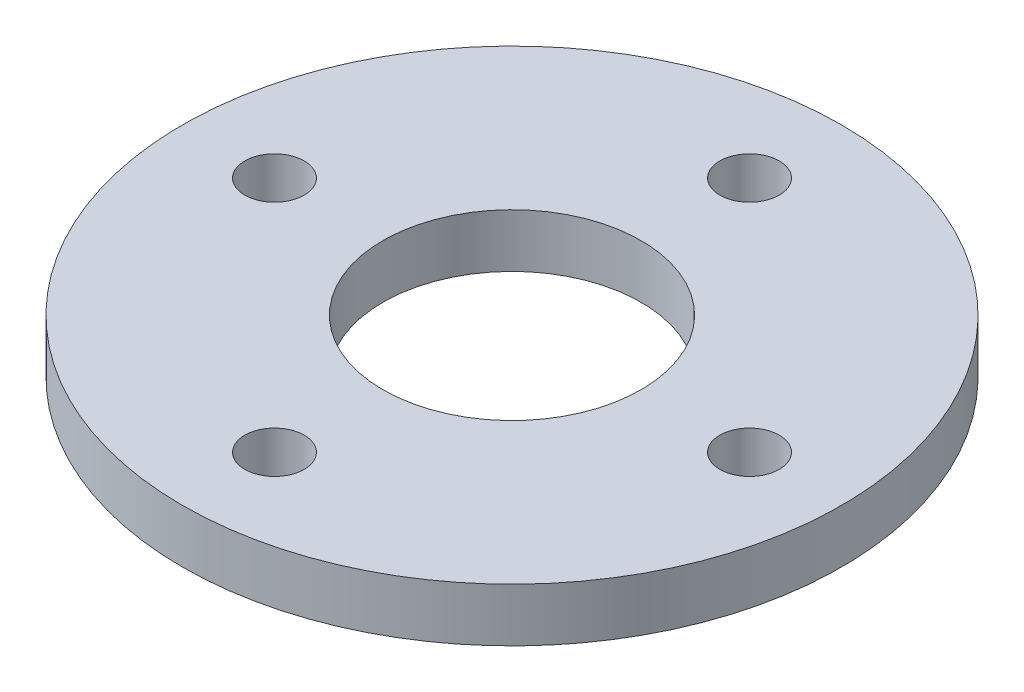
ISO-10303-21;
HEADER;
FILE_DESCRIPTION(('STEP AP214'),'2;1');
FILE_NAME('part.step','',(''),(''),'','','');
FILE_SCHEMA(('AUTOMOTIVE_DESIGN { 1 0 10303 214 1 1 1 1 }'));
ENDSEC;
DATA;
#1=APPLICATION_CONTEXT('core data for automotive mechanical design processes');
#2=APPLICATION_PROTOCOL_DEFINITION('international standard','automotive_design',2000,#1);
#3=PRODUCT_CONTEXT('',#1,'mechanical');
#4=PRODUCT('Part','Part','',(#3));
#5=PRODUCT_RELATED_PRODUCT_CATEGORY('part','',(#4));
#6=PRODUCT_DEFINITION_FORMATION('','',#4);
#7=PRODUCT_DEFINITION_CONTEXT('part definition',#1,'design');
#8=PRODUCT_DEFINITION('design','',#6,#7);
#9=PRODUCT_DEFINITION_SHAPE('','',#8);
#10=(LENGTH_UNIT() NAMED_UNIT(*) SI_UNIT(.MILLI.,.METRE.));
#11=(NAMED_UNIT(*) PLANE_ANGLE_UNIT() SI_UNIT($,.RADIAN.));
#12=(NAMED_UNIT(*) SI_UNIT($,.STERADIAN.) SOLID_ANGLE_UNIT());
#13=UNCERTAINTY_MEASURE_WITH_UNIT(LENGTH_MEASURE(1.E-05),#10,'distance_accuracy_value','');
#14=(GEOMETRIC_REPRESENTATION_CONTEXT(3) GLOBAL_UNCERTAINTY_ASSIGNED_CONTEXT((#13)) GLOBAL_UNIT_ASSIGNED_CONTEXT((#10,
#11,#12)) REPRESENTATION_CONTEXT('',''));
#15=CARTESIAN_POINT('',(0.,0.,0.));
#16=DIRECTION('',(0.,0.,1.));
#17=DIRECTION('',(1.,0.,0.));
#18=AXIS2_PLACEMENT_3D('',#15,#16,#17);
#19=CARTESIAN_POINT('',(-3.72963719657829,-54.041040513086,-32.6949223256916));
#20=DIRECTION('',(0.,1.,0.));
#21=DIRECTION('',(0.,0.,1.));
#22=AXIS2_PLACEMENT_3D('',#19,#20,#21);
#23=PLANE('',#22);
#24=CARTESIAN_POINT('',(-3.72963719657829,-54.041040513086,-24.6949223256916));
#25=DIRECTION('',(0.,1.,0.));
#26=DIRECTION('',(0.,0.,1.));
#27=AXIS2_PLACEMENT_3D('',#24,#25,#26);
#28=CIRCLE('',#27,0.999999999999998);
#29=CARTESIAN_POINT('',(-3.72963719657829,-54.041040513086,-23.6949223256916));
#30=VERTEX_POINT('',#29);
#31=EDGE_CURVE('E59',#30,#30,#28,.T.);
#32=ORIENTED_EDGE('',*,*,#31,.F.);
#33=EDGE_LOOP('',(#32));
#34=FACE_BOUND('',#33,.T.);
#35=CARTESIAN_POINT('',(-3.72963719657829,-54.041040513086,-40.6949223256916));
#36=DIRECTION('',(0.,1.,0.));
#37=DIRECTION('',(0.,0.,1.));
#38=AXIS2_PLACEMENT_3D('',#35,#36,#37);
#39=CIRCLE('',#38,1.);
#40=CARTESIAN_POINT('',(-3.72963719657829,-54.041040513086,-39.6949223256916));
#41=VERTEX_POINT('',#40);
#42=EDGE_CURVE('E47',#41,#41,#39,.T.);
#43=ORIENTED_EDGE('',*,*,#42,.F.);
#44=EDGE_LOOP('',(#43));
#45=FACE_BOUND('',#44,.T.);
#46=CARTESIAN_POINT('',(-3.72963719657829,-54.041040513086,-32.6949223256916));
#47=DIRECTION('',(0.,1.,0.));
#48=DIRECTION('',(0.,0.,1.));
#49=AXIS2_PLACEMENT_3D('',#46,#47,#48);
#50=CIRCLE('',#49,11.1);
#51=CARTESIAN_POINT('',(-3.72963719657829,-54.041040513086,-21.5949223256916));
#52=VERTEX_POINT('',#51);
#53=EDGE_CURVE('E10',#52,#52,#50,.T.);
#54=ORIENTED_EDGE('',*,*,#53,.T.);
#55=EDGE_LOOP('',(#54));
#56=FACE_BOUND('',#55,.T.);
#57=CARTESIAN_POINT('',(-11.7296371965783,-54.041040513086,-32.6949223256916));
#58=DIRECTION('',(0.,1.,0.));
#59=DIRECTION('',(0.,0.,1.));
#60=AXIS2_PLACEMENT_3D('',#57,#58,#59);
#61=CIRCLE('',#60,0.999999999999997);
#62=CARTESIAN_POINT('',(-11.7296371965783,-54.041040513086,-31.6949223256916));
#63=VERTEX_POINT('',#62);
#64=EDGE_CURVE('E42',#63,#63,#61,.T.);
#65=ORIENTED_EDGE('',*,*,#64,.F.);
#66=EDGE_LOOP('',(#65));
#67=FACE_BOUND('',#66,.T.);
#68=CARTESIAN_POINT('',(4.2703628034217,-54.041040513086,-32.6949223256916));
#69=DIRECTION('',(0.,1.,0.));
#70=DIRECTION('',(0.,0.,1.));
#71=AXIS2_PLACEMENT_3D('',#68,#69,#70);
#72=CIRCLE('',#71,0.999999999999994);
#73=CARTESIAN_POINT('',(4.2703628034217,-54.041040513086,-31.6949223256916));
#74=VERTEX_POINT('',#73);
#75=EDGE_CURVE('E53',#74,#74,#72,.T.);
#76=ORIENTED_EDGE('',*,*,#75,.F.);
#77=EDGE_LOOP('',(#76));
#78=FACE_BOUND('',#77,.T.);
#79=CARTESIAN_POINT('',(-3.72963719657829,-54.041040513086,-32.6949223256916));
#80=DIRECTION('',(0.,1.,0.));
#81=DIRECTION('',(0.,0.,1.));
#82=AXIS2_PLACEMENT_3D('',#79,#80,#81);
#83=CIRCLE('',#82,4.35000000000001);
#84=CARTESIAN_POINT('',(-3.72963719657829,-54.041040513086,-28.3449223256916));
#85=VERTEX_POINT('',#84);
#86=EDGE_CURVE('E65',#85,#85,#83,.T.);
#87=ORIENTED_EDGE('',*,*,#86,.F.);
#88=EDGE_LOOP('',(#87));
#89=FACE_BOUND('',#88,.T.);
#90=ADVANCED_FACE('F31',(#34,#45,#56,#67,#78,#89),#23,.T.);
#91=CARTESIAN_POINT('',(-3.72963719657829,-55.841040513086,-32.6949223256916));
#92=DIRECTION('',(0.,1.,0.));
#93=DIRECTION('',(0.,0.,1.));
#94=AXIS2_PLACEMENT_3D('',#91,#92,#93);
#95=PLANE('',#94);
#96=CARTESIAN_POINT('',(-3.72963719657829,-55.841040513086,-32.6949223256916));
#97=DIRECTION('',(0.,1.,0.));
#98=DIRECTION('',(0.,0.,1.));
#99=AXIS2_PLACEMENT_3D('',#96,#97,#98);
#100=CIRCLE('',#99,11.1);
#101=CARTESIAN_POINT('',(-3.72963719657829,-55.841040513086,-21.5949223256916));
#102=VERTEX_POINT('',#101);
#103=EDGE_CURVE('E35',#102,#102,#100,.T.);
#104=ORIENTED_EDGE('',*,*,#103,.F.);
#105=EDGE_LOOP('',(#104));
#106=FACE_BOUND('',#105,.T.);
#107=CARTESIAN_POINT('',(-11.7296371965783,-55.841040513086,-32.6949223256916));
#108=DIRECTION('',(0.,1.,0.));
#109=DIRECTION('',(0.,0.,1.));
#110=AXIS2_PLACEMENT_3D('',#107,#108,#109);
#111=CIRCLE('',#110,0.999999999999997);
#112=CARTESIAN_POINT('',(-11.7296371965783,-55.841040513086,-31.6949223256916));
#113=VERTEX_POINT('',#112);
#114=EDGE_CURVE('E44',#113,#113,#111,.T.);
#115=ORIENTED_EDGE('',*,*,#114,.T.);
#116=EDGE_LOOP('',(#115));
#117=FACE_BOUND('',#116,.T.);
#118=CARTESIAN_POINT('',(-3.72963719657829,-55.841040513086,-40.6949223256916));
#119=DIRECTION('',(0.,1.,0.));
#120=DIRECTION('',(0.,0.,1.));
#121=AXIS2_PLACEMENT_3D('',#118,#119,#120);
#122=CIRCLE('',#121,1.);
#123=CARTESIAN_POINT('',(-3.72963719657829,-55.841040513086,-39.6949223256916));
#124=VERTEX_POINT('',#123);
#125=EDGE_CURVE('E50',#124,#124,#122,.T.);
#126=ORIENTED_EDGE('',*,*,#125,.T.);
#127=EDGE_LOOP('',(#126));
#128=FACE_BOUND('',#127,.T.);
#129=CARTESIAN_POINT('',(4.2703628034217,-55.841040513086,-32.6949223256916));
#130=DIRECTION('',(0.,1.,0.));
#131=DIRECTION('',(0.,0.,1.));
#132=AXIS2_PLACEMENT_3D('',#129,#130,#131);
#133=CIRCLE('',#132,0.999999999999994);
#134=CARTESIAN_POINT('',(4.2703628034217,-55.841040513086,-31.6949223256916));
#135=VERTEX_POINT('',#134);
#136=EDGE_CURVE('E56',#135,#135,#133,.T.);
#137=ORIENTED_EDGE('',*,*,#136,.T.);
#138=EDGE_LOOP('',(#137));
#139=FACE_BOUND('',#138,.T.);
#140=CARTESIAN_POINT('',(-3.72963719657829,-55.841040513086,-24.6949223256916));
#141=DIRECTION('',(0.,1.,0.));
#142=DIRECTION('',(0.,0.,1.));
#143=AXIS2_PLACEMENT_3D('',#140,#141,#142);
#144=CIRCLE('',#143,0.999999999999998);
#145=CARTESIAN_POINT('',(-3.72963719657829,-55.841040513086,-23.6949223256916));
#146=VERTEX_POINT('',#145);
#147=EDGE_CURVE('E62',#146,#146,#144,.T.);
#148=ORIENTED_EDGE('',*,*,#147,.T.);
#149=EDGE_LOOP('',(#148));
#150=FACE_BOUND('',#149,.T.);
#151=CARTESIAN_POINT('',(-3.72963719657829,-55.841040513086,-32.6949223256916));
#152=DIRECTION('',(0.,1.,0.));
#153=DIRECTION('',(0.,0.,1.));
#154=AXIS2_PLACEMENT_3D('',#151,#152,#153);
#155=CIRCLE('',#154,4.35000000000001);
#156=CARTESIAN_POINT('',(-3.72963719657829,-55.841040513086,-28.3449223256916));
#157=VERTEX_POINT('',#156);
#158=EDGE_CURVE('E68',#157,#157,#155,.T.);
#159=ORIENTED_EDGE('',*,*,#158,.T.);
#160=EDGE_LOOP('',(#159));
#161=FACE_BOUND('',#160,.T.);
#162=ADVANCED_FACE('F78',(#106,#117,#128,#139,#150,#161),#95,.F.);
#163=CARTESIAN_POINT('',(-3.72963719657829,-54.041040513086,-32.6949223256916));
#164=DIRECTION('',(0.,-1.,0.));
#165=DIRECTION('',(0.,0.,-1.));
#166=AXIS2_PLACEMENT_3D('',#163,#164,#165);
#167=CYLINDRICAL_SURFACE('',#166,11.1);
#168=ORIENTED_EDGE('',*,*,#53,.F.);
#169=EDGE_LOOP('',(#168));
#170=FACE_BOUND('',#169,.T.);
#171=ORIENTED_EDGE('',*,*,#103,.T.);
#172=EDGE_LOOP('',(#171));
#173=FACE_BOUND('',#172,.T.);
#174=ADVANCED_FACE('F33',(#170,#173),#167,.T.);
#175=CARTESIAN_POINT('',(-11.7296371965783,-54.041040513086,-32.6949223256916));
#176=DIRECTION('',(0.,-1.,0.));
#177=DIRECTION('',(0.,0.,-1.));
#178=AXIS2_PLACEMENT_3D('',#175,#176,#177);
#179=CYLINDRICAL_SURFACE('',#178,0.999999999999997);
#180=ORIENTED_EDGE('',*,*,#64,.T.);
#181=EDGE_LOOP('',(#180));
#182=FACE_BOUND('',#181,.T.);
#183=ORIENTED_EDGE('',*,*,#114,.F.);
#184=EDGE_LOOP('',(#183));
#185=FACE_BOUND('',#184,.T.);
#186=ADVANCED_FACE('F88',(#182,#185),#179,.F.);
#187=CARTESIAN_POINT('',(-3.72963719657829,-54.041040513086,-40.6949223256916));
#188=DIRECTION('',(0.,-1.,0.));
#189=DIRECTION('',(0.,0.,-1.));
#190=AXIS2_PLACEMENT_3D('',#187,#188,#189);
#191=CYLINDRICAL_SURFACE('',#190,1.);
#192=ORIENTED_EDGE('',*,*,#42,.T.);
#193=EDGE_LOOP('',(#192));
#194=FACE_BOUND('',#193,.T.);
#195=ORIENTED_EDGE('',*,*,#125,.F.);
#196=EDGE_LOOP('',(#195));
#197=FACE_BOUND('',#196,.T.);
#198=ADVANCED_FACE('F91',(#194,#197),#191,.F.);
#199=CARTESIAN_POINT('',(4.2703628034217,-54.041040513086,-32.6949223256916));
#200=DIRECTION('',(0.,-1.,0.));
#201=DIRECTION('',(0.,0.,-1.));
#202=AXIS2_PLACEMENT_3D('',#199,#200,#201);
#203=CYLINDRICAL_SURFACE('',#202,0.999999999999994);
#204=ORIENTED_EDGE('',*,*,#75,.T.);
#205=EDGE_LOOP('',(#204));
#206=FACE_BOUND('',#205,.T.);
#207=ORIENTED_EDGE('',*,*,#136,.F.);
#208=EDGE_LOOP('',(#207));
#209=FACE_BOUND('',#208,.T.);
#210=ADVANCED_FACE('F95',(#206,#209),#203,.F.);
#211=CARTESIAN_POINT('',(-3.72963719657829,-54.041040513086,-24.6949223256916));
#212=DIRECTION('',(0.,-1.,0.));
#213=DIRECTION('',(0.,0.,-1.));
#214=AXIS2_PLACEMENT_3D('',#211,#212,#213);
#215=CYLINDRICAL_SURFACE('',#214,0.999999999999998);
#216=ORIENTED_EDGE('',*,*,#31,.T.);
#217=EDGE_LOOP('',(#216));
#218=FACE_BOUND('',#217,.T.);
#219=ORIENTED_EDGE('',*,*,#147,.F.);
#220=EDGE_LOOP('',(#219));
#221=FACE_BOUND('',#220,.T.);
#222=ADVANCED_FACE('F99',(#218,#221),#215,.F.);
#223=CARTESIAN_POINT('',(-3.72963719657829,-54.041040513086,-32.6949223256916));
#224=DIRECTION('',(0.,-1.,0.));
#225=DIRECTION('',(0.,0.,-1.));
#226=AXIS2_PLACEMENT_3D('',#223,#224,#225);
#227=CYLINDRICAL_SURFACE('',#226,4.35000000000001);
#228=ORIENTED_EDGE('',*,*,#86,.T.);
#229=EDGE_LOOP('',(#228));
#230=FACE_BOUND('',#229,.T.);
#231=ORIENTED_EDGE('',*,*,#158,.F.);
#232=EDGE_LOOP('',(#231));
#233=FACE_BOUND('',#232,.T.);
#234=ADVANCED_FACE('F74',(#230,#233),#227,.F.);
#235=CLOSED_SHELL('',(#90,#162,#174,#186,#198,#210,#222,#234));
#236=MANIFOLD_SOLID_BREP('B2',#235);
#237=ADVANCED_BREP_SHAPE_REPRESENTATION('',(#18,#236),#14);
#238=SHAPE_DEFINITION_REPRESENTATION(#9,#237);
ENDSEC;
END-ISO-10303-21;
